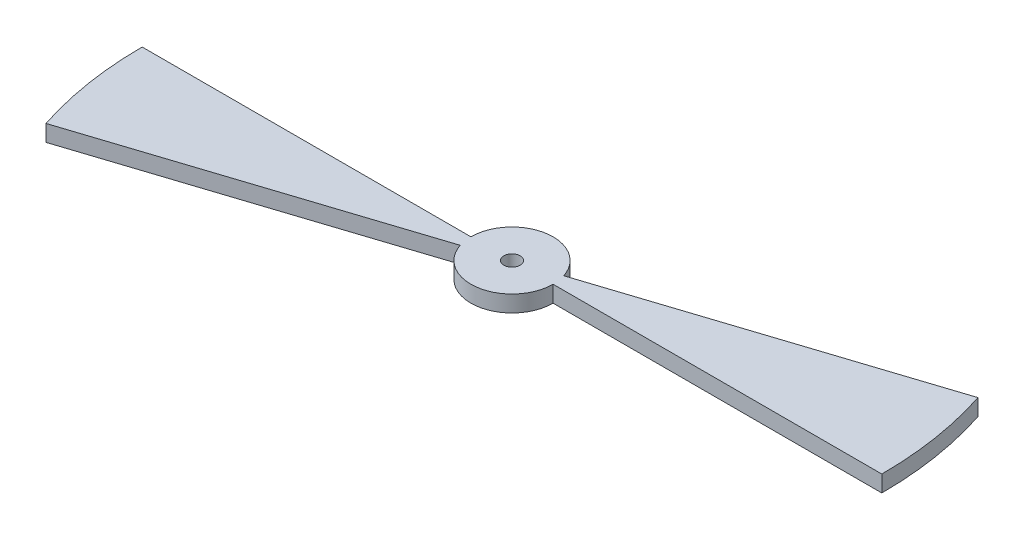
ISO-10303-21;
HEADER;
FILE_DESCRIPTION(('STEP AP214'),'2;1');
FILE_NAME('part.step','',(''),(''),'','','');
FILE_SCHEMA(('AUTOMOTIVE_DESIGN { 1 0 10303 214 1 1 1 1 }'));
ENDSEC;
DATA;
#1=APPLICATION_CONTEXT('core data for automotive mechanical design processes');
#2=APPLICATION_PROTOCOL_DEFINITION('international standard','automotive_design',2000,#1);
#3=PRODUCT_CONTEXT('',#1,'mechanical');
#4=PRODUCT('Part','Part','',(#3));
#5=PRODUCT_RELATED_PRODUCT_CATEGORY('part','',(#4));
#6=PRODUCT_DEFINITION_FORMATION('','',#4);
#7=PRODUCT_DEFINITION_CONTEXT('part definition',#1,'design');
#8=PRODUCT_DEFINITION('design','',#6,#7);
#9=PRODUCT_DEFINITION_SHAPE('','',#8);
#10=(LENGTH_UNIT() NAMED_UNIT(*) SI_UNIT(.MILLI.,.METRE.));
#11=(NAMED_UNIT(*) PLANE_ANGLE_UNIT() SI_UNIT($,.RADIAN.));
#12=(NAMED_UNIT(*) SI_UNIT($,.STERADIAN.) SOLID_ANGLE_UNIT());
#13=UNCERTAINTY_MEASURE_WITH_UNIT(LENGTH_MEASURE(1.E-05),#10,'distance_accuracy_value','');
#14=(GEOMETRIC_REPRESENTATION_CONTEXT(3) GLOBAL_UNCERTAINTY_ASSIGNED_CONTEXT((#13)) GLOBAL_UNIT_ASSIGNED_CONTEXT((#10,
#11,#12)) REPRESENTATION_CONTEXT('',''));
#15=CARTESIAN_POINT('',(0.,0.,0.));
#16=DIRECTION('',(0.,0.,1.));
#17=DIRECTION('',(1.,0.,0.));
#18=AXIS2_PLACEMENT_3D('',#15,#16,#17);
#19=CARTESIAN_POINT('',(0.,1.,0.));
#20=DIRECTION('',(0.,0.,1.));
#21=DIRECTION('',(1.,0.,0.));
#22=AXIS2_PLACEMENT_3D('',#19,#20,#21);
#23=PLANE('',#22);
#24=DIRECTION('',(-1.,0.,0.));
#25=VECTOR('',#24,1.);
#26=CARTESIAN_POINT('',(0.,0.,0.));
#27=LINE('',#26,#25);
#28=CARTESIAN_POINT('',(-2.5,0.,0.));
#29=VERTEX_POINT('',#28);
#30=CARTESIAN_POINT('',(-22.5,0.,0.));
#31=VERTEX_POINT('',#30);
#32=EDGE_CURVE('E135',#29,#31,#27,.T.);
#33=ORIENTED_EDGE('',*,*,#32,.T.);
#34=DIRECTION('',(0.,-1.,0.));
#35=VECTOR('',#34,1.);
#36=CARTESIAN_POINT('',(-22.5,1.,0.));
#37=LINE('',#36,#35);
#38=CARTESIAN_POINT('',(-22.5,1.,0.));
#39=VERTEX_POINT('',#38);
#40=EDGE_CURVE('E11',#39,#31,#37,.T.);
#41=ORIENTED_EDGE('',*,*,#40,.F.);
#42=DIRECTION('',(-1.,0.,0.));
#43=VECTOR('',#42,1.);
#44=CARTESIAN_POINT('',(0.,1.,0.));
#45=LINE('',#44,#43);
#46=CARTESIAN_POINT('',(-2.5,1.,0.));
#47=VERTEX_POINT('',#46);
#48=EDGE_CURVE('E154',#47,#39,#45,.T.);
#49=ORIENTED_EDGE('',*,*,#48,.F.);
#50=DIRECTION('',(0.,-1.,0.));
#51=VECTOR('',#50,1.);
#52=CARTESIAN_POINT('',(-2.5,1.,0.));
#53=LINE('',#52,#51);
#54=EDGE_CURVE('E134',#47,#29,#53,.T.);
#55=ORIENTED_EDGE('',*,*,#54,.T.);
#56=EDGE_LOOP('',(#33,#41,#49,#55));
#57=FACE_BOUND('',#56,.T.);
#58=ADVANCED_FACE('F35',(#57),#23,.F.);
#59=CARTESIAN_POINT('',(0.,1.,0.));
#60=DIRECTION('',(0.,-1.,0.));
#61=DIRECTION('',(0.,0.,-1.));
#62=AXIS2_PLACEMENT_3D('',#59,#60,#61);
#63=CYLINDRICAL_SURFACE('',#62,22.5);
#64=CARTESIAN_POINT('',(0.,0.,0.));
#65=DIRECTION('',(0.,1.,0.));
#66=DIRECTION('',(0.,0.,1.));
#67=AXIS2_PLACEMENT_3D('',#64,#65,#66);
#68=CIRCLE('',#67,22.5);
#69=CARTESIAN_POINT('',(-21.3987716166409,0.,6.95288237343632));
#70=VERTEX_POINT('',#69);
#71=EDGE_CURVE('E138',#31,#70,#68,.T.);
#72=ORIENTED_EDGE('',*,*,#71,.T.);
#73=DIRECTION('',(0.,-1.,0.));
#74=VECTOR('',#73,1.);
#75=CARTESIAN_POINT('',(-21.3987716166409,1.,6.95288237343632));
#76=LINE('',#75,#74);
#77=CARTESIAN_POINT('',(-21.3987716166409,1.,6.95288237343632));
#78=VERTEX_POINT('',#77);
#79=EDGE_CURVE('E43',#78,#70,#76,.T.);
#80=ORIENTED_EDGE('',*,*,#79,.F.);
#81=CARTESIAN_POINT('',(0.,1.,0.));
#82=DIRECTION('',(0.,1.,0.));
#83=DIRECTION('',(0.,0.,1.));
#84=AXIS2_PLACEMENT_3D('',#81,#82,#83);
#85=CIRCLE('',#84,22.5);
#86=EDGE_CURVE('E90',#39,#78,#85,.T.);
#87=ORIENTED_EDGE('',*,*,#86,.F.);
#88=ORIENTED_EDGE('',*,*,#40,.T.);
#89=EDGE_LOOP('',(#72,#80,#87,#88));
#90=FACE_BOUND('',#89,.T.);
#91=ADVANCED_FACE('F168',(#90),#63,.T.);
#92=CARTESIAN_POINT('',(0.,1.,0.));
#93=DIRECTION('',(0.309016994374948,0.,0.951056516295153));
#94=DIRECTION('',(0.951056516295153,0.,-0.309016994374948));
#95=AXIS2_PLACEMENT_3D('',#92,#93,#94);
#96=PLANE('',#95);
#97=DIRECTION('',(-0.951056516295153,0.,0.309016994374948));
#98=VECTOR('',#97,1.);
#99=CARTESIAN_POINT('',(0.,0.,0.));
#100=LINE('',#99,#98);
#101=CARTESIAN_POINT('',(-2.37764129073789,0.,0.772542485937353));
#102=VERTEX_POINT('',#101);
#103=EDGE_CURVE('E141',#102,#70,#100,.T.);
#104=ORIENTED_EDGE('',*,*,#103,.F.);
#105=DIRECTION('',(0.,-1.,0.));
#106=VECTOR('',#105,1.);
#107=CARTESIAN_POINT('',(-2.37764129073789,1.,0.772542485937353));
#108=LINE('',#107,#106);
#109=CARTESIAN_POINT('',(-2.37764129073789,1.,0.772542485937353));
#110=VERTEX_POINT('',#109);
#111=EDGE_CURVE('E161',#110,#102,#108,.T.);
#112=ORIENTED_EDGE('',*,*,#111,.F.);
#113=DIRECTION('',(-0.951056516295153,0.,0.309016994374948));
#114=VECTOR('',#113,1.);
#115=CARTESIAN_POINT('',(0.,1.,0.));
#116=LINE('',#115,#114);
#117=EDGE_CURVE('E167',#110,#78,#116,.T.);
#118=ORIENTED_EDGE('',*,*,#117,.T.);
#119=ORIENTED_EDGE('',*,*,#79,.T.);
#120=EDGE_LOOP('',(#104,#112,#118,#119));
#121=FACE_BOUND('',#120,.T.);
#122=ADVANCED_FACE('F165',(#121),#96,.T.);
#123=CARTESIAN_POINT('',(0.,1.,0.));
#124=DIRECTION('',(0.,-1.,0.));
#125=DIRECTION('',(0.,0.,-1.));
#126=AXIS2_PLACEMENT_3D('',#123,#124,#125);
#127=CYLINDRICAL_SURFACE('',#126,2.5);
#128=CARTESIAN_POINT('',(0.,0.,0.));
#129=DIRECTION('',(0.,1.,0.));
#130=DIRECTION('',(0.,0.,1.));
#131=AXIS2_PLACEMENT_3D('',#128,#129,#130);
#132=CIRCLE('',#131,2.5);
#133=CARTESIAN_POINT('',(2.5,0.,0.));
#134=VERTEX_POINT('',#133);
#135=EDGE_CURVE('E144',#102,#134,#132,.T.);
#136=ORIENTED_EDGE('',*,*,#135,.T.);
#137=DIRECTION('',(0.,-1.,0.));
#138=VECTOR('',#137,1.);
#139=CARTESIAN_POINT('',(2.5,1.,0.));
#140=LINE('',#139,#138);
#141=CARTESIAN_POINT('',(2.5,1.,0.));
#142=VERTEX_POINT('',#141);
#143=EDGE_CURVE('E158',#142,#134,#140,.T.);
#144=ORIENTED_EDGE('',*,*,#143,.F.);
#145=CARTESIAN_POINT('',(0.,1.,0.));
#146=DIRECTION('',(0.,1.,0.));
#147=DIRECTION('',(0.,0.,1.));
#148=AXIS2_PLACEMENT_3D('',#145,#146,#147);
#149=CIRCLE('',#148,2.5);
#150=EDGE_CURVE('E129',#110,#142,#149,.T.);
#151=ORIENTED_EDGE('',*,*,#150,.F.);
#152=ORIENTED_EDGE('',*,*,#111,.T.);
#153=EDGE_LOOP('',(#136,#144,#151,#152));
#154=FACE_BOUND('',#153,.T.);
#155=ADVANCED_FACE('F178',(#154),#127,.T.);
#156=CARTESIAN_POINT('',(0.,1.,0.));
#157=DIRECTION('',(0.,0.,-1.));
#158=DIRECTION('',(-1.,0.,0.));
#159=AXIS2_PLACEMENT_3D('',#156,#157,#158);
#160=PLANE('',#159);
#161=DIRECTION('',(1.,0.,0.));
#162=VECTOR('',#161,1.);
#163=CARTESIAN_POINT('',(0.,0.,0.));
#164=LINE('',#163,#162);
#165=CARTESIAN_POINT('',(22.5,0.,0.));
#166=VERTEX_POINT('',#165);
#167=EDGE_CURVE('E146',#134,#166,#164,.T.);
#168=ORIENTED_EDGE('',*,*,#167,.T.);
#169=DIRECTION('',(0.,-1.,0.));
#170=VECTOR('',#169,1.);
#171=CARTESIAN_POINT('',(22.5,1.,0.));
#172=LINE('',#171,#170);
#173=CARTESIAN_POINT('',(22.5,1.,0.));
#174=VERTEX_POINT('',#173);
#175=EDGE_CURVE('E123',#174,#166,#172,.T.);
#176=ORIENTED_EDGE('',*,*,#175,.F.);
#177=DIRECTION('',(1.,0.,0.));
#178=VECTOR('',#177,1.);
#179=CARTESIAN_POINT('',(0.,1.,0.));
#180=LINE('',#179,#178);
#181=EDGE_CURVE('E110',#142,#174,#180,.T.);
#182=ORIENTED_EDGE('',*,*,#181,.F.);
#183=ORIENTED_EDGE('',*,*,#143,.T.);
#184=EDGE_LOOP('',(#168,#176,#182,#183));
#185=FACE_BOUND('',#184,.T.);
#186=ADVANCED_FACE('F181',(#185),#160,.F.);
#187=CARTESIAN_POINT('',(0.,1.,0.));
#188=DIRECTION('',(0.,-1.,0.));
#189=DIRECTION('',(0.,0.,-1.));
#190=AXIS2_PLACEMENT_3D('',#187,#188,#189);
#191=CYLINDRICAL_SURFACE('',#190,22.5);
#192=CARTESIAN_POINT('',(0.,0.,0.));
#193=DIRECTION('',(0.,1.,0.));
#194=DIRECTION('',(0.,0.,1.));
#195=AXIS2_PLACEMENT_3D('',#192,#193,#194);
#196=CIRCLE('',#195,22.5);
#197=CARTESIAN_POINT('',(21.3987716166409,0.,-6.95288237343632));
#198=VERTEX_POINT('',#197);
#199=EDGE_CURVE('E119',#166,#198,#196,.T.);
#200=ORIENTED_EDGE('',*,*,#199,.T.);
#201=DIRECTION('',(0.,-1.,0.));
#202=VECTOR('',#201,1.);
#203=CARTESIAN_POINT('',(21.3987716166409,1.,-6.95288237343632));
#204=LINE('',#203,#202);
#205=CARTESIAN_POINT('',(21.3987716166409,1.,-6.95288237343632));
#206=VERTEX_POINT('',#205);
#207=EDGE_CURVE('E116',#206,#198,#204,.T.);
#208=ORIENTED_EDGE('',*,*,#207,.F.);
#209=CARTESIAN_POINT('',(0.,1.,0.));
#210=DIRECTION('',(0.,1.,0.));
#211=DIRECTION('',(0.,0.,1.));
#212=AXIS2_PLACEMENT_3D('',#209,#210,#211);
#213=CIRCLE('',#212,22.5);
#214=EDGE_CURVE('E103',#174,#206,#213,.T.);
#215=ORIENTED_EDGE('',*,*,#214,.F.);
#216=ORIENTED_EDGE('',*,*,#175,.T.);
#217=EDGE_LOOP('',(#200,#208,#215,#216));
#218=FACE_BOUND('',#217,.T.);
#219=ADVANCED_FACE('F117',(#218),#191,.T.);
#220=CARTESIAN_POINT('',(0.,1.,0.));
#221=DIRECTION('',(-0.309016994374949,0.,-0.951056516295153));
#222=DIRECTION('',(-0.951056516295153,0.,0.309016994374949));
#223=AXIS2_PLACEMENT_3D('',#220,#221,#222);
#224=PLANE('',#223);
#225=DIRECTION('',(0.951056516295153,0.,-0.309016994374949));
#226=VECTOR('',#225,1.);
#227=CARTESIAN_POINT('',(0.,0.,0.));
#228=LINE('',#227,#226);
#229=CARTESIAN_POINT('',(2.37764129073789,0.,-0.772542485937338));
#230=VERTEX_POINT('',#229);
#231=EDGE_CURVE('E149',#230,#198,#228,.T.);
#232=ORIENTED_EDGE('',*,*,#231,.F.);
#233=DIRECTION('',(0.,-1.,0.));
#234=VECTOR('',#233,1.);
#235=CARTESIAN_POINT('',(2.37764129073789,1.,-0.772542485937338));
#236=LINE('',#235,#234);
#237=CARTESIAN_POINT('',(2.37764129073789,1.,-0.772542485937338));
#238=VERTEX_POINT('',#237);
#239=EDGE_CURVE('E79',#238,#230,#236,.T.);
#240=ORIENTED_EDGE('',*,*,#239,.F.);
#241=DIRECTION('',(0.951056516295153,0.,-0.309016994374949));
#242=VECTOR('',#241,1.);
#243=CARTESIAN_POINT('',(0.,1.,0.));
#244=LINE('',#243,#242);
#245=EDGE_CURVE('E108',#238,#206,#244,.T.);
#246=ORIENTED_EDGE('',*,*,#245,.T.);
#247=ORIENTED_EDGE('',*,*,#207,.T.);
#248=EDGE_LOOP('',(#232,#240,#246,#247));
#249=FACE_BOUND('',#248,.T.);
#250=ADVANCED_FACE('F125',(#249),#224,.T.);
#251=EDGE_CURVE('E82',#230,#29,#132,.T.);
#252=ORIENTED_EDGE('',*,*,#251,.T.);
#253=ORIENTED_EDGE('',*,*,#54,.F.);
#254=EDGE_CURVE('E51',#238,#47,#149,.T.);
#255=ORIENTED_EDGE('',*,*,#254,.F.);
#256=ORIENTED_EDGE('',*,*,#239,.T.);
#257=EDGE_LOOP('',(#252,#253,#255,#256));
#258=FACE_BOUND('',#257,.T.);
#259=ADVANCED_FACE('F187',(#258),#127,.T.);
#260=CARTESIAN_POINT('',(0.,1.,0.));
#261=DIRECTION('',(0.,-1.,0.));
#262=DIRECTION('',(0.,0.,-1.));
#263=AXIS2_PLACEMENT_3D('',#260,#261,#262);
#264=CYLINDRICAL_SURFACE('',#263,0.5);
#265=CARTESIAN_POINT('',(0.,1.,0.));
#266=DIRECTION('',(0.,1.,0.));
#267=DIRECTION('',(0.,0.,1.));
#268=AXIS2_PLACEMENT_3D('',#265,#266,#267);
#269=CIRCLE('',#268,0.5);
#270=CARTESIAN_POINT('',(0.,1.,0.5));
#271=VERTEX_POINT('',#270);
#272=EDGE_CURVE('E127',#271,#271,#269,.T.);
#273=ORIENTED_EDGE('',*,*,#272,.T.);
#274=EDGE_LOOP('',(#273));
#275=FACE_BOUND('',#274,.T.);
#276=CARTESIAN_POINT('',(0.,0.,0.));
#277=DIRECTION('',(0.,1.,0.));
#278=DIRECTION('',(0.,0.,1.));
#279=AXIS2_PLACEMENT_3D('',#276,#277,#278);
#280=CIRCLE('',#279,0.5);
#281=CARTESIAN_POINT('',(0.,0.,0.5));
#282=VERTEX_POINT('',#281);
#283=EDGE_CURVE('E151',#282,#282,#280,.T.);
#284=ORIENTED_EDGE('',*,*,#283,.F.);
#285=EDGE_LOOP('',(#284));
#286=FACE_BOUND('',#285,.T.);
#287=ADVANCED_FACE('F189',(#275,#286),#264,.F.);
#288=CARTESIAN_POINT('',(0.,1.,0.));
#289=DIRECTION('',(0.,1.,0.));
#290=DIRECTION('',(0.,0.,1.));
#291=AXIS2_PLACEMENT_3D('',#288,#289,#290);
#292=PLANE('',#291);
#293=ORIENTED_EDGE('',*,*,#48,.T.);
#294=ORIENTED_EDGE('',*,*,#86,.T.);
#295=ORIENTED_EDGE('',*,*,#117,.F.);
#296=ORIENTED_EDGE('',*,*,#150,.T.);
#297=ORIENTED_EDGE('',*,*,#181,.T.);
#298=ORIENTED_EDGE('',*,*,#214,.T.);
#299=ORIENTED_EDGE('',*,*,#245,.F.);
#300=ORIENTED_EDGE('',*,*,#254,.T.);
#301=EDGE_LOOP('',(#293,#294,#295,#296,#297,#298,#299,#300));
#302=FACE_BOUND('',#301,.T.);
#303=ORIENTED_EDGE('',*,*,#272,.F.);
#304=EDGE_LOOP('',(#303));
#305=FACE_BOUND('',#304,.T.);
#306=ADVANCED_FACE('F105',(#302,#305),#292,.T.);
#307=CARTESIAN_POINT('',(0.,0.,0.));
#308=DIRECTION('',(0.,1.,0.));
#309=DIRECTION('',(0.,0.,1.));
#310=AXIS2_PLACEMENT_3D('',#307,#308,#309);
#311=PLANE('',#310);
#312=ORIENTED_EDGE('',*,*,#32,.F.);
#313=ORIENTED_EDGE('',*,*,#251,.F.);
#314=ORIENTED_EDGE('',*,*,#231,.T.);
#315=ORIENTED_EDGE('',*,*,#199,.F.);
#316=ORIENTED_EDGE('',*,*,#167,.F.);
#317=ORIENTED_EDGE('',*,*,#135,.F.);
#318=ORIENTED_EDGE('',*,*,#103,.T.);
#319=ORIENTED_EDGE('',*,*,#71,.F.);
#320=EDGE_LOOP('',(#312,#313,#314,#315,#316,#317,#318,#319));
#321=FACE_BOUND('',#320,.T.);
#322=ORIENTED_EDGE('',*,*,#283,.T.);
#323=EDGE_LOOP('',(#322));
#324=FACE_BOUND('',#323,.T.);
#325=ADVANCED_FACE('F173',(#321,#324),#311,.F.);
#326=CLOSED_SHELL('',(#58,#91,#122,#155,#186,#219,#250,#259,#287,#306,#325));
#327=MANIFOLD_SOLID_BREP('B2',#326);
#328=ADVANCED_BREP_SHAPE_REPRESENTATION('',(#18,#327),#14);
#329=SHAPE_DEFINITION_REPRESENTATION(#9,#328);
ENDSEC;
END-ISO-10303-21;
